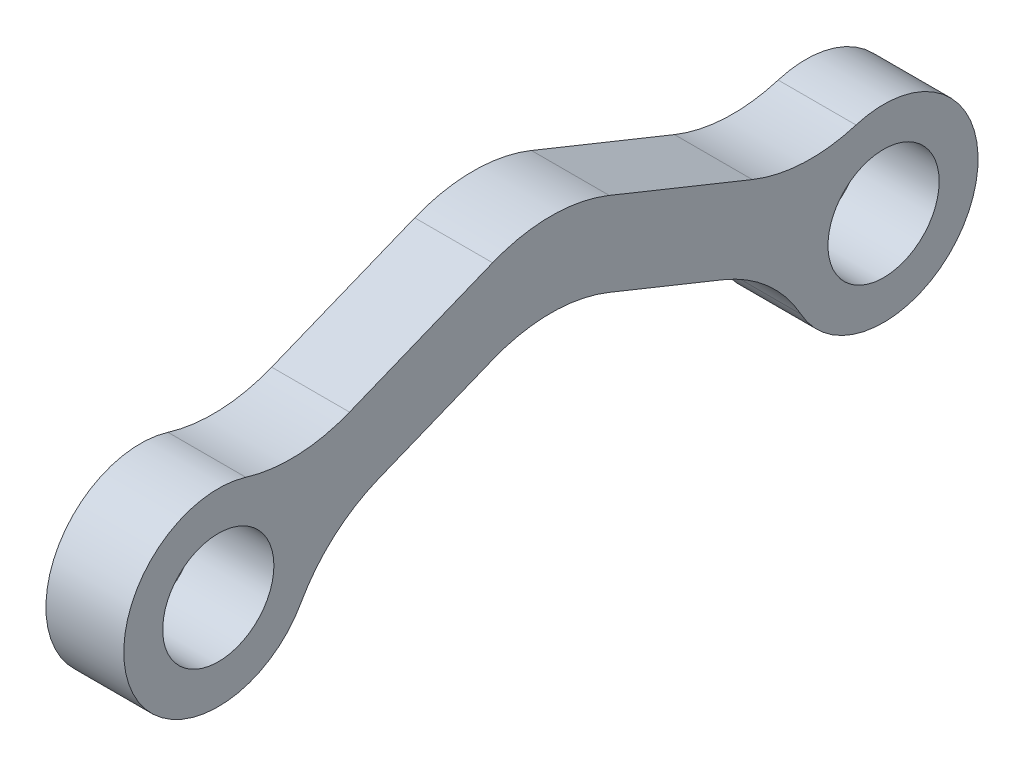
ISO-10303-21;
HEADER;
FILE_DESCRIPTION(('STEP AP214'),'2;1');
FILE_NAME('part.step','',(''),(''),'','','');
FILE_SCHEMA(('AUTOMOTIVE_DESIGN { 1 0 10303 214 1 1 1 1 }'));
ENDSEC;
DATA;
#1=APPLICATION_CONTEXT('core data for automotive mechanical design processes');
#2=APPLICATION_PROTOCOL_DEFINITION('international standard','automotive_design',2000,#1);
#3=PRODUCT_CONTEXT('',#1,'mechanical');
#4=PRODUCT('Part','Part','',(#3));
#5=PRODUCT_RELATED_PRODUCT_CATEGORY('part','',(#4));
#6=PRODUCT_DEFINITION_FORMATION('','',#4);
#7=PRODUCT_DEFINITION_CONTEXT('part definition',#1,'design');
#8=PRODUCT_DEFINITION('design','',#6,#7);
#9=PRODUCT_DEFINITION_SHAPE('','',#8);
#10=(LENGTH_UNIT() NAMED_UNIT(*) SI_UNIT(.MILLI.,.METRE.));
#11=(NAMED_UNIT(*) PLANE_ANGLE_UNIT() SI_UNIT($,.RADIAN.));
#12=(NAMED_UNIT(*) SI_UNIT($,.STERADIAN.) SOLID_ANGLE_UNIT());
#13=UNCERTAINTY_MEASURE_WITH_UNIT(LENGTH_MEASURE(1.E-05),#10,'distance_accuracy_value','');
#14=(GEOMETRIC_REPRESENTATION_CONTEXT(3) GLOBAL_UNCERTAINTY_ASSIGNED_CONTEXT((#13)) GLOBAL_UNIT_ASSIGNED_CONTEXT((#10,
#11,#12)) REPRESENTATION_CONTEXT('',''));
#15=CARTESIAN_POINT('',(0.,0.,0.));
#16=DIRECTION('',(0.,0.,1.));
#17=DIRECTION('',(1.,0.,0.));
#18=AXIS2_PLACEMENT_3D('',#15,#16,#17);
#19=CARTESIAN_POINT('',(5.,15.373044737521,38.0387186051064));
#20=DIRECTION('',(-1.,0.,0.));
#21=DIRECTION('',(0.,0.,1.));
#22=AXIS2_PLACEMENT_3D('',#19,#20,#21);
#23=PLANE('',#22);
#24=CARTESIAN_POINT('',(5.,15.373044737521,38.0387186051064));
#25=DIRECTION('',(-1.,0.,0.));
#26=DIRECTION('',(0.,0.,1.));
#27=AXIS2_PLACEMENT_3D('',#24,#25,#26);
#28=CIRCLE('',#27,10.);
#29=CARTESIAN_POINT('',(5.,6.10120619185315,34.2926526709472));
#30=VERTEX_POINT('',#29);
#31=CARTESIAN_POINT('',(5.,5.80674434080601,40.951774855818));
#32=VERTEX_POINT('',#31);
#33=EDGE_CURVE('E202',#30,#32,#28,.T.);
#34=ORIENTED_EDGE('',*,*,#33,.T.);
#35=CARTESIAN_POINT('',(5.,0.,42.72));
#36=DIRECTION('',(1.,0.,0.));
#37=DIRECTION('',(0.,0.,1.));
#38=AXIS2_PLACEMENT_3D('',#35,#36,#37);
#39=CIRCLE('',#38,6.07);
#40=CARTESIAN_POINT('',(5.,-2.9487099174709,37.414341716374));
#41=VERTEX_POINT('',#40);
#42=EDGE_CURVE('E114',#32,#41,#39,.T.);
#43=ORIENTED_EDGE('',*,*,#42,.T.);
#44=CARTESIAN_POINT('',(5.,-7.80655162664866,28.6735537697085));
#45=DIRECTION('',(-1.,0.,0.));
#46=DIRECTION('',(0.,0.,-1.));
#47=AXIS2_PLACEMENT_3D('',#44,#45,#46);
#48=CIRCLE('',#47,10.);
#49=CARTESIAN_POINT('',(5.,1.46528691901921,32.4196197038677));
#50=VERTEX_POINT('',#49);
#51=EDGE_CURVE('E239',#41,#50,#48,.T.);
#52=ORIENTED_EDGE('',*,*,#51,.T.);
#53=DIRECTION('',(0.,0.374606593415913,-0.927183854566787));
#54=VECTOR('',#53,1.);
#55=CARTESIAN_POINT('',(5.,1.46528691901921,32.4196197038677));
#56=LINE('',#55,#54);
#57=CARTESIAN_POINT('',(5.,4.42015444603704,25.1060659341591));
#58=VERTEX_POINT('',#57);
#59=EDGE_CURVE('E259',#50,#58,#56,.T.);
#60=ORIENTED_EDGE('',*,*,#59,.T.);
#61=CARTESIAN_POINT('',(5.,-4.85168409963083,21.36));
#62=DIRECTION('',(-1.,0.,0.));
#63=DIRECTION('',(0.,0.,-1.));
#64=AXIS2_PLACEMENT_3D('',#61,#62,#63);
#65=CIRCLE('',#64,10.);
#66=CARTESIAN_POINT('',(5.,4.42015444603704,17.6139340658409));
#67=VERTEX_POINT('',#66);
#68=EDGE_CURVE('E255',#58,#67,#65,.T.);
#69=ORIENTED_EDGE('',*,*,#68,.T.);
#70=DIRECTION('',(0.,-0.374606593415913,-0.927183854566787));
#71=VECTOR('',#70,1.);
#72=CARTESIAN_POINT('',(5.,1.46528691901921,10.3003802961323));
#73=LINE('',#72,#71);
#74=CARTESIAN_POINT('',(5.,1.46528691901921,10.3003802961323));
#75=VERTEX_POINT('',#74);
#76=EDGE_CURVE('E258',#67,#75,#73,.T.);
#77=ORIENTED_EDGE('',*,*,#76,.T.);
#78=CARTESIAN_POINT('',(5.,-7.80655162664866,14.0464462302915));
#79=DIRECTION('',(-1.,0.,0.));
#80=DIRECTION('',(0.,0.,1.));
#81=AXIS2_PLACEMENT_3D('',#78,#79,#80);
#82=CIRCLE('',#81,10.);
#83=CARTESIAN_POINT('',(5.,-2.9487099174709,5.30565828362596));
#84=VERTEX_POINT('',#83);
#85=EDGE_CURVE('E263',#75,#84,#82,.T.);
#86=ORIENTED_EDGE('',*,*,#85,.T.);
#87=CARTESIAN_POINT('',(5.,0.,0.));
#88=DIRECTION('',(1.,0.,0.));
#89=DIRECTION('',(0.,0.,-1.));
#90=AXIS2_PLACEMENT_3D('',#87,#88,#89);
#91=CIRCLE('',#90,6.07);
#92=CARTESIAN_POINT('',(5.,5.80674434080601,1.76822514418198));
#93=VERTEX_POINT('',#92);
#94=EDGE_CURVE('E270',#84,#93,#91,.T.);
#95=ORIENTED_EDGE('',*,*,#94,.T.);
#96=CARTESIAN_POINT('',(5.,15.373044737521,4.68128139489364));
#97=DIRECTION('',(-1.,0.,0.));
#98=DIRECTION('',(0.,0.,-1.));
#99=AXIS2_PLACEMENT_3D('',#96,#97,#98);
#100=CIRCLE('',#99,10.);
#101=CARTESIAN_POINT('',(5.,6.10120619185315,8.42734732905277));
#102=VERTEX_POINT('',#101);
#103=EDGE_CURVE('E145',#93,#102,#100,.T.);
#104=ORIENTED_EDGE('',*,*,#103,.T.);
#105=DIRECTION('',(0.,0.374606593415913,0.927183854566787));
#106=VECTOR('',#105,1.);
#107=CARTESIAN_POINT('',(5.,6.10120619185315,8.42734732905277));
#108=LINE('',#107,#106);
#109=CARTESIAN_POINT('',(5.,9.81282815942497,17.6139340658409));
#110=VERTEX_POINT('',#109);
#111=EDGE_CURVE('E139',#102,#110,#108,.T.);
#112=ORIENTED_EDGE('',*,*,#111,.T.);
#113=CARTESIAN_POINT('',(5.,0.540989613757094,21.36));
#114=DIRECTION('',(1.,0.,0.));
#115=DIRECTION('',(0.,0.,-1.));
#116=AXIS2_PLACEMENT_3D('',#113,#114,#115);
#117=CIRCLE('',#116,10.);
#118=CARTESIAN_POINT('',(5.,9.81282815942497,25.1060659341591));
#119=VERTEX_POINT('',#118);
#120=EDGE_CURVE('E143',#110,#119,#117,.T.);
#121=ORIENTED_EDGE('',*,*,#120,.T.);
#122=DIRECTION('',(0.,-0.374606593415913,0.927183854566787));
#123=VECTOR('',#122,1.);
#124=CARTESIAN_POINT('',(5.,6.10120619185315,34.2926526709472));
#125=LINE('',#124,#123);
#126=EDGE_CURVE('E59',#119,#30,#125,.T.);
#127=ORIENTED_EDGE('',*,*,#126,.T.);
#128=EDGE_LOOP('',(#34,#43,#52,#60,#69,#77,#86,#95,#104,#112,#121,#127));
#129=FACE_BOUND('',#128,.T.);
#130=CARTESIAN_POINT('',(5.,0.,0.));
#131=DIRECTION('',(1.,0.,0.));
#132=DIRECTION('',(0.,0.,-1.));
#133=AXIS2_PLACEMENT_3D('',#130,#131,#132);
#134=CIRCLE('',#133,3.57);
#135=CARTESIAN_POINT('',(5.,0.,-3.57));
#136=VERTEX_POINT('',#135);
#137=EDGE_CURVE('E172',#136,#136,#134,.T.);
#138=ORIENTED_EDGE('',*,*,#137,.F.);
#139=EDGE_LOOP('',(#138));
#140=FACE_BOUND('',#139,.T.);
#141=CARTESIAN_POINT('',(5.,0.,42.72));
#142=DIRECTION('',(1.,0.,0.));
#143=DIRECTION('',(0.,0.,-1.));
#144=AXIS2_PLACEMENT_3D('',#141,#142,#143);
#145=CIRCLE('',#144,3.57);
#146=CARTESIAN_POINT('',(5.,0.,39.15));
#147=VERTEX_POINT('',#146);
#148=EDGE_CURVE('E313',#147,#147,#145,.T.);
#149=ORIENTED_EDGE('',*,*,#148,.F.);
#150=EDGE_LOOP('',(#149));
#151=FACE_BOUND('',#150,.T.);
#152=ADVANCED_FACE('F41',(#129,#140,#151),#23,.F.);
#153=CARTESIAN_POINT('',(0.,15.373044737521,38.0387186051064));
#154=DIRECTION('',(-1.,0.,0.));
#155=DIRECTION('',(0.,0.,1.));
#156=AXIS2_PLACEMENT_3D('',#153,#154,#155);
#157=PLANE('',#156);
#158=CARTESIAN_POINT('',(0.,0.,0.));
#159=DIRECTION('',(1.,0.,0.));
#160=DIRECTION('',(0.,0.,-1.));
#161=AXIS2_PLACEMENT_3D('',#158,#159,#160);
#162=CIRCLE('',#161,3.57);
#163=CARTESIAN_POINT('',(0.,0.,-3.57));
#164=VERTEX_POINT('',#163);
#165=EDGE_CURVE('E320',#164,#164,#162,.T.);
#166=ORIENTED_EDGE('',*,*,#165,.T.);
#167=EDGE_LOOP('',(#166));
#168=FACE_BOUND('',#167,.T.);
#169=CARTESIAN_POINT('',(0.,15.373044737521,38.0387186051064));
#170=DIRECTION('',(-1.,0.,0.));
#171=DIRECTION('',(0.,0.,1.));
#172=AXIS2_PLACEMENT_3D('',#169,#170,#171);
#173=CIRCLE('',#172,10.);
#174=CARTESIAN_POINT('',(0.,6.10120619185315,34.2926526709472));
#175=VERTEX_POINT('',#174);
#176=CARTESIAN_POINT('',(0.,5.80674434080601,40.951774855818));
#177=VERTEX_POINT('',#176);
#178=EDGE_CURVE('E167',#175,#177,#173,.T.);
#179=ORIENTED_EDGE('',*,*,#178,.F.);
#180=DIRECTION('',(0.,-0.374606593415913,0.927183854566787));
#181=VECTOR('',#180,1.);
#182=CARTESIAN_POINT('',(0.,6.10120619185315,34.2926526709472));
#183=LINE('',#182,#181);
#184=CARTESIAN_POINT('',(0.,9.81282815942497,25.1060659341591));
#185=VERTEX_POINT('',#184);
#186=EDGE_CURVE('E106',#185,#175,#183,.T.);
#187=ORIENTED_EDGE('',*,*,#186,.F.);
#188=CARTESIAN_POINT('',(0.,0.540989613757094,21.36));
#189=DIRECTION('',(1.,0.,0.));
#190=DIRECTION('',(0.,0.,-1.));
#191=AXIS2_PLACEMENT_3D('',#188,#189,#190);
#192=CIRCLE('',#191,10.);
#193=CARTESIAN_POINT('',(0.,9.81282815942497,17.6139340658409));
#194=VERTEX_POINT('',#193);
#195=EDGE_CURVE('E100',#194,#185,#192,.T.);
#196=ORIENTED_EDGE('',*,*,#195,.F.);
#197=DIRECTION('',(0.,0.374606593415913,0.927183854566787));
#198=VECTOR('',#197,1.);
#199=CARTESIAN_POINT('',(0.,6.10120619185315,8.42734732905277));
#200=LINE('',#199,#198);
#201=CARTESIAN_POINT('',(0.,6.10120619185315,8.42734732905277));
#202=VERTEX_POINT('',#201);
#203=EDGE_CURVE('E154',#202,#194,#200,.T.);
#204=ORIENTED_EDGE('',*,*,#203,.F.);
#205=CARTESIAN_POINT('',(0.,15.373044737521,4.68128139489364));
#206=DIRECTION('',(-1.,0.,0.));
#207=DIRECTION('',(0.,0.,-1.));
#208=AXIS2_PLACEMENT_3D('',#205,#206,#207);
#209=CIRCLE('',#208,10.);
#210=CARTESIAN_POINT('',(0.,5.80674434080601,1.76822514418198));
#211=VERTEX_POINT('',#210);
#212=EDGE_CURVE('E193',#211,#202,#209,.T.);
#213=ORIENTED_EDGE('',*,*,#212,.F.);
#214=CARTESIAN_POINT('',(0.,0.,0.));
#215=DIRECTION('',(1.,0.,0.));
#216=DIRECTION('',(0.,0.,-1.));
#217=AXIS2_PLACEMENT_3D('',#214,#215,#216);
#218=CIRCLE('',#217,6.07);
#219=CARTESIAN_POINT('',(0.,-2.9487099174709,5.30565828362596));
#220=VERTEX_POINT('',#219);
#221=EDGE_CURVE('E190',#220,#211,#218,.T.);
#222=ORIENTED_EDGE('',*,*,#221,.F.);
#223=CARTESIAN_POINT('',(0.,-7.80655162664866,14.0464462302915));
#224=DIRECTION('',(-1.,0.,0.));
#225=DIRECTION('',(0.,0.,1.));
#226=AXIS2_PLACEMENT_3D('',#223,#224,#225);
#227=CIRCLE('',#226,10.);
#228=CARTESIAN_POINT('',(0.,1.46528691901921,10.3003802961323));
#229=VERTEX_POINT('',#228);
#230=EDGE_CURVE('E187',#229,#220,#227,.T.);
#231=ORIENTED_EDGE('',*,*,#230,.F.);
#232=DIRECTION('',(0.,-0.374606593415913,-0.927183854566787));
#233=VECTOR('',#232,1.);
#234=CARTESIAN_POINT('',(0.,1.46528691901921,10.3003802961323));
#235=LINE('',#234,#233);
#236=CARTESIAN_POINT('',(0.,4.42015444603704,17.6139340658409));
#237=VERTEX_POINT('',#236);
#238=EDGE_CURVE('E184',#237,#229,#235,.T.);
#239=ORIENTED_EDGE('',*,*,#238,.F.);
#240=CARTESIAN_POINT('',(0.,-4.85168409963083,21.36));
#241=DIRECTION('',(-1.,0.,0.));
#242=DIRECTION('',(0.,0.,-1.));
#243=AXIS2_PLACEMENT_3D('',#240,#241,#242);
#244=CIRCLE('',#243,10.);
#245=CARTESIAN_POINT('',(0.,4.42015444603704,25.1060659341591));
#246=VERTEX_POINT('',#245);
#247=EDGE_CURVE('E181',#246,#237,#244,.T.);
#248=ORIENTED_EDGE('',*,*,#247,.F.);
#249=DIRECTION('',(0.,0.374606593415913,-0.927183854566787));
#250=VECTOR('',#249,1.);
#251=CARTESIAN_POINT('',(0.,1.46528691901921,32.4196197038677));
#252=LINE('',#251,#250);
#253=CARTESIAN_POINT('',(0.,1.46528691901921,32.4196197038677));
#254=VERTEX_POINT('',#253);
#255=EDGE_CURVE('E178',#254,#246,#252,.T.);
#256=ORIENTED_EDGE('',*,*,#255,.F.);
#257=CARTESIAN_POINT('',(0.,-7.80655162664866,28.6735537697085));
#258=DIRECTION('',(-1.,0.,0.));
#259=DIRECTION('',(0.,0.,-1.));
#260=AXIS2_PLACEMENT_3D('',#257,#258,#259);
#261=CIRCLE('',#260,10.);
#262=CARTESIAN_POINT('',(0.,-2.9487099174709,37.414341716374));
#263=VERTEX_POINT('',#262);
#264=EDGE_CURVE('E175',#263,#254,#261,.T.);
#265=ORIENTED_EDGE('',*,*,#264,.F.);
#266=CARTESIAN_POINT('',(0.,0.,42.72));
#267=DIRECTION('',(1.,0.,0.));
#268=DIRECTION('',(0.,0.,1.));
#269=AXIS2_PLACEMENT_3D('',#266,#267,#268);
#270=CIRCLE('',#269,6.07);
#271=EDGE_CURVE('E171',#177,#263,#270,.T.);
#272=ORIENTED_EDGE('',*,*,#271,.F.);
#273=EDGE_LOOP('',(#179,#187,#196,#204,#213,#222,#231,#239,#248,#256,#265,#272));
#274=FACE_BOUND('',#273,.T.);
#275=CARTESIAN_POINT('',(0.,0.,42.72));
#276=DIRECTION('',(1.,0.,0.));
#277=DIRECTION('',(0.,0.,-1.));
#278=AXIS2_PLACEMENT_3D('',#275,#276,#277);
#279=CIRCLE('',#278,3.57);
#280=CARTESIAN_POINT('',(0.,0.,39.15));
#281=VERTEX_POINT('',#280);
#282=EDGE_CURVE('E316',#281,#281,#279,.T.);
#283=ORIENTED_EDGE('',*,*,#282,.T.);
#284=EDGE_LOOP('',(#283));
#285=FACE_BOUND('',#284,.T.);
#286=ADVANCED_FACE('F243',(#168,#274,#285),#157,.T.);
#287=CARTESIAN_POINT('',(5.,15.373044737521,38.0387186051064));
#288=DIRECTION('',(-1.,0.,0.));
#289=DIRECTION('',(0.,0.,1.));
#290=AXIS2_PLACEMENT_3D('',#287,#288,#289);
#291=CYLINDRICAL_SURFACE('',#290,10.);
#292=ORIENTED_EDGE('',*,*,#178,.T.);
#293=DIRECTION('',(-1.,0.,0.));
#294=VECTOR('',#293,1.);
#295=CARTESIAN_POINT('',(5.,5.80674434080601,40.951774855818));
#296=LINE('',#295,#294);
#297=EDGE_CURVE('E11',#32,#177,#296,.T.);
#298=ORIENTED_EDGE('',*,*,#297,.F.);
#299=ORIENTED_EDGE('',*,*,#33,.F.);
#300=DIRECTION('',(-1.,0.,0.));
#301=VECTOR('',#300,1.);
#302=CARTESIAN_POINT('',(5.,6.10120619185315,34.2926526709472));
#303=LINE('',#302,#301);
#304=EDGE_CURVE('E163',#30,#175,#303,.T.);
#305=ORIENTED_EDGE('',*,*,#304,.T.);
#306=EDGE_LOOP('',(#292,#298,#299,#305));
#307=FACE_BOUND('',#306,.T.);
#308=ADVANCED_FACE('F43',(#307),#291,.F.);
#309=CARTESIAN_POINT('',(5.,0.,42.72));
#310=DIRECTION('',(-1.,0.,0.));
#311=DIRECTION('',(0.,0.,1.));
#312=AXIS2_PLACEMENT_3D('',#309,#310,#311);
#313=CYLINDRICAL_SURFACE('',#312,6.07);
#314=ORIENTED_EDGE('',*,*,#271,.T.);
#315=DIRECTION('',(-1.,0.,0.));
#316=VECTOR('',#315,1.);
#317=CARTESIAN_POINT('',(5.,-2.9487099174709,37.414341716374));
#318=LINE('',#317,#316);
#319=EDGE_CURVE('E51',#41,#263,#318,.T.);
#320=ORIENTED_EDGE('',*,*,#319,.F.);
#321=ORIENTED_EDGE('',*,*,#42,.F.);
#322=ORIENTED_EDGE('',*,*,#297,.T.);
#323=EDGE_LOOP('',(#314,#320,#321,#322));
#324=FACE_BOUND('',#323,.T.);
#325=ADVANCED_FACE('F421',(#324),#313,.T.);
#326=CARTESIAN_POINT('',(5.,-7.80655162664866,28.6735537697085));
#327=DIRECTION('',(-1.,0.,0.));
#328=DIRECTION('',(0.,0.,1.));
#329=AXIS2_PLACEMENT_3D('',#326,#327,#328);
#330=CYLINDRICAL_SURFACE('',#329,10.);
#331=ORIENTED_EDGE('',*,*,#264,.T.);
#332=DIRECTION('',(-1.,0.,0.));
#333=VECTOR('',#332,1.);
#334=CARTESIAN_POINT('',(5.,1.46528691901921,32.4196197038677));
#335=LINE('',#334,#333);
#336=EDGE_CURVE('E229',#50,#254,#335,.T.);
#337=ORIENTED_EDGE('',*,*,#336,.F.);
#338=ORIENTED_EDGE('',*,*,#51,.F.);
#339=ORIENTED_EDGE('',*,*,#319,.T.);
#340=EDGE_LOOP('',(#331,#337,#338,#339));
#341=FACE_BOUND('',#340,.T.);
#342=ADVANCED_FACE('F237',(#341),#330,.F.);
#343=CARTESIAN_POINT('',(5.,1.46528691901921,32.4196197038677));
#344=DIRECTION('',(0.,0.927183854566787,0.374606593415913));
#345=DIRECTION('',(0.,-0.374606593415913,0.927183854566787));
#346=AXIS2_PLACEMENT_3D('',#343,#344,#345);
#347=PLANE('',#346);
#348=ORIENTED_EDGE('',*,*,#255,.T.);
#349=DIRECTION('',(-1.,0.,0.));
#350=VECTOR('',#349,1.);
#351=CARTESIAN_POINT('',(5.,4.42015444603704,25.1060659341591));
#352=LINE('',#351,#350);
#353=EDGE_CURVE('E225',#58,#246,#352,.T.);
#354=ORIENTED_EDGE('',*,*,#353,.F.);
#355=ORIENTED_EDGE('',*,*,#59,.F.);
#356=ORIENTED_EDGE('',*,*,#336,.T.);
#357=EDGE_LOOP('',(#348,#354,#355,#356));
#358=FACE_BOUND('',#357,.T.);
#359=ADVANCED_FACE('F249',(#358),#347,.F.);
#360=CARTESIAN_POINT('',(5.,-4.85168409963083,21.36));
#361=DIRECTION('',(-1.,0.,0.));
#362=DIRECTION('',(0.,0.,1.));
#363=AXIS2_PLACEMENT_3D('',#360,#361,#362);
#364=CYLINDRICAL_SURFACE('',#363,10.);
#365=ORIENTED_EDGE('',*,*,#247,.T.);
#366=DIRECTION('',(-1.,0.,0.));
#367=VECTOR('',#366,1.);
#368=CARTESIAN_POINT('',(5.,4.42015444603704,17.6139340658409));
#369=LINE('',#368,#367);
#370=EDGE_CURVE('E221',#67,#237,#369,.T.);
#371=ORIENTED_EDGE('',*,*,#370,.F.);
#372=ORIENTED_EDGE('',*,*,#68,.F.);
#373=ORIENTED_EDGE('',*,*,#353,.T.);
#374=EDGE_LOOP('',(#365,#371,#372,#373));
#375=FACE_BOUND('',#374,.T.);
#376=ADVANCED_FACE('F253',(#375),#364,.F.);
#377=CARTESIAN_POINT('',(5.,1.46528691901921,10.3003802961323));
#378=DIRECTION('',(0.,0.927183854566787,-0.374606593415913));
#379=DIRECTION('',(0.,0.374606593415913,0.927183854566787));
#380=AXIS2_PLACEMENT_3D('',#377,#378,#379);
#381=PLANE('',#380);
#382=ORIENTED_EDGE('',*,*,#238,.T.);
#383=DIRECTION('',(-1.,0.,0.));
#384=VECTOR('',#383,1.);
#385=CARTESIAN_POINT('',(5.,1.46528691901921,10.3003802961323));
#386=LINE('',#385,#384);
#387=EDGE_CURVE('E217',#75,#229,#386,.T.);
#388=ORIENTED_EDGE('',*,*,#387,.F.);
#389=ORIENTED_EDGE('',*,*,#76,.F.);
#390=ORIENTED_EDGE('',*,*,#370,.T.);
#391=EDGE_LOOP('',(#382,#388,#389,#390));
#392=FACE_BOUND('',#391,.T.);
#393=ADVANCED_FACE('F386',(#392),#381,.F.);
#394=CARTESIAN_POINT('',(5.,-7.80655162664866,14.0464462302915));
#395=DIRECTION('',(-1.,0.,0.));
#396=DIRECTION('',(0.,0.,1.));
#397=AXIS2_PLACEMENT_3D('',#394,#395,#396);
#398=CYLINDRICAL_SURFACE('',#397,10.);
#399=ORIENTED_EDGE('',*,*,#230,.T.);
#400=DIRECTION('',(-1.,0.,0.));
#401=VECTOR('',#400,1.);
#402=CARTESIAN_POINT('',(5.,-2.9487099174709,5.30565828362596));
#403=LINE('',#402,#401);
#404=EDGE_CURVE('E213',#84,#220,#403,.T.);
#405=ORIENTED_EDGE('',*,*,#404,.F.);
#406=ORIENTED_EDGE('',*,*,#85,.F.);
#407=ORIENTED_EDGE('',*,*,#387,.T.);
#408=EDGE_LOOP('',(#399,#405,#406,#407));
#409=FACE_BOUND('',#408,.T.);
#410=ADVANCED_FACE('F377',(#409),#398,.F.);
#411=CARTESIAN_POINT('',(5.,0.,0.));
#412=DIRECTION('',(-1.,0.,0.));
#413=DIRECTION('',(0.,0.,1.));
#414=AXIS2_PLACEMENT_3D('',#411,#412,#413);
#415=CYLINDRICAL_SURFACE('',#414,6.07);
#416=ORIENTED_EDGE('',*,*,#221,.T.);
#417=DIRECTION('',(-1.,0.,0.));
#418=VECTOR('',#417,1.);
#419=CARTESIAN_POINT('',(5.,5.80674434080601,1.76822514418198));
#420=LINE('',#419,#418);
#421=EDGE_CURVE('E209',#93,#211,#420,.T.);
#422=ORIENTED_EDGE('',*,*,#421,.F.);
#423=ORIENTED_EDGE('',*,*,#94,.F.);
#424=ORIENTED_EDGE('',*,*,#404,.T.);
#425=EDGE_LOOP('',(#416,#422,#423,#424));
#426=FACE_BOUND('',#425,.T.);
#427=ADVANCED_FACE('F278',(#426),#415,.T.);
#428=CARTESIAN_POINT('',(5.,15.373044737521,4.68128139489364));
#429=DIRECTION('',(-1.,0.,0.));
#430=DIRECTION('',(0.,0.,1.));
#431=AXIS2_PLACEMENT_3D('',#428,#429,#430);
#432=CYLINDRICAL_SURFACE('',#431,10.);
#433=ORIENTED_EDGE('',*,*,#212,.T.);
#434=DIRECTION('',(-1.,0.,0.));
#435=VECTOR('',#434,1.);
#436=CARTESIAN_POINT('',(5.,6.10120619185315,8.42734732905277));
#437=LINE('',#436,#435);
#438=EDGE_CURVE('E156',#102,#202,#437,.T.);
#439=ORIENTED_EDGE('',*,*,#438,.F.);
#440=ORIENTED_EDGE('',*,*,#103,.F.);
#441=ORIENTED_EDGE('',*,*,#421,.T.);
#442=EDGE_LOOP('',(#433,#439,#440,#441));
#443=FACE_BOUND('',#442,.T.);
#444=ADVANCED_FACE('F282',(#443),#432,.F.);
#445=CARTESIAN_POINT('',(5.,6.10120619185315,8.42734732905277));
#446=DIRECTION('',(0.,-0.927183854566787,0.374606593415913));
#447=DIRECTION('',(0.,-0.374606593415913,-0.927183854566787));
#448=AXIS2_PLACEMENT_3D('',#445,#446,#447);
#449=PLANE('',#448);
#450=ORIENTED_EDGE('',*,*,#203,.T.);
#451=DIRECTION('',(-1.,0.,0.));
#452=VECTOR('',#451,1.);
#453=CARTESIAN_POINT('',(5.,9.81282815942497,17.6139340658409));
#454=LINE('',#453,#452);
#455=EDGE_CURVE('E151',#110,#194,#454,.T.);
#456=ORIENTED_EDGE('',*,*,#455,.F.);
#457=ORIENTED_EDGE('',*,*,#111,.F.);
#458=ORIENTED_EDGE('',*,*,#438,.T.);
#459=EDGE_LOOP('',(#450,#456,#457,#458));
#460=FACE_BOUND('',#459,.T.);
#461=ADVANCED_FACE('F152',(#460),#449,.F.);
#462=CARTESIAN_POINT('',(5.,0.540989613757094,21.36));
#463=DIRECTION('',(-1.,0.,0.));
#464=DIRECTION('',(0.,0.,1.));
#465=AXIS2_PLACEMENT_3D('',#462,#463,#464);
#466=CYLINDRICAL_SURFACE('',#465,10.);
#467=ORIENTED_EDGE('',*,*,#195,.T.);
#468=DIRECTION('',(-1.,0.,0.));
#469=VECTOR('',#468,1.);
#470=CARTESIAN_POINT('',(5.,9.81282815942497,25.1060659341591));
#471=LINE('',#470,#469);
#472=EDGE_CURVE('E157',#119,#185,#471,.T.);
#473=ORIENTED_EDGE('',*,*,#472,.F.);
#474=ORIENTED_EDGE('',*,*,#120,.F.);
#475=ORIENTED_EDGE('',*,*,#455,.T.);
#476=EDGE_LOOP('',(#467,#473,#474,#475));
#477=FACE_BOUND('',#476,.T.);
#478=ADVANCED_FACE('F159',(#477),#466,.T.);
#479=CARTESIAN_POINT('',(5.,6.10120619185315,34.2926526709472));
#480=DIRECTION('',(0.,-0.927183854566787,-0.374606593415913));
#481=DIRECTION('',(0.,0.374606593415913,-0.927183854566787));
#482=AXIS2_PLACEMENT_3D('',#479,#480,#481);
#483=PLANE('',#482);
#484=ORIENTED_EDGE('',*,*,#186,.T.);
#485=ORIENTED_EDGE('',*,*,#304,.F.);
#486=ORIENTED_EDGE('',*,*,#126,.F.);
#487=ORIENTED_EDGE('',*,*,#472,.T.);
#488=EDGE_LOOP('',(#484,#485,#486,#487));
#489=FACE_BOUND('',#488,.T.);
#490=ADVANCED_FACE('F286',(#489),#483,.F.);
#491=CARTESIAN_POINT('',(5.,0.,0.));
#492=DIRECTION('',(-1.,0.,0.));
#493=DIRECTION('',(0.,0.,1.));
#494=AXIS2_PLACEMENT_3D('',#491,#492,#493);
#495=CYLINDRICAL_SURFACE('',#494,3.57);
#496=ORIENTED_EDGE('',*,*,#137,.T.);
#497=EDGE_LOOP('',(#496));
#498=FACE_BOUND('',#497,.T.);
#499=ORIENTED_EDGE('',*,*,#165,.F.);
#500=EDGE_LOOP('',(#499));
#501=FACE_BOUND('',#500,.T.);
#502=ADVANCED_FACE('F288',(#498,#501),#495,.F.);
#503=CARTESIAN_POINT('',(5.,0.,42.72));
#504=DIRECTION('',(-1.,0.,0.));
#505=DIRECTION('',(0.,0.,1.));
#506=AXIS2_PLACEMENT_3D('',#503,#504,#505);
#507=CYLINDRICAL_SURFACE('',#506,3.57);
#508=ORIENTED_EDGE('',*,*,#148,.T.);
#509=EDGE_LOOP('',(#508));
#510=FACE_BOUND('',#509,.T.);
#511=ORIENTED_EDGE('',*,*,#282,.F.);
#512=EDGE_LOOP('',(#511));
#513=FACE_BOUND('',#512,.T.);
#514=ADVANCED_FACE('F294',(#510,#513),#507,.F.);
#515=CLOSED_SHELL('',(#152,#286,#308,#325,#342,#359,#376,#393,#410,#427,#444,#461,#478,#490,
#502,#514));
#516=MANIFOLD_SOLID_BREP('B2',#515);
#517=ADVANCED_BREP_SHAPE_REPRESENTATION('',(#18,#516),#14);
#518=SHAPE_DEFINITION_REPRESENTATION(#9,#517);
ENDSEC;
END-ISO-10303-21;
